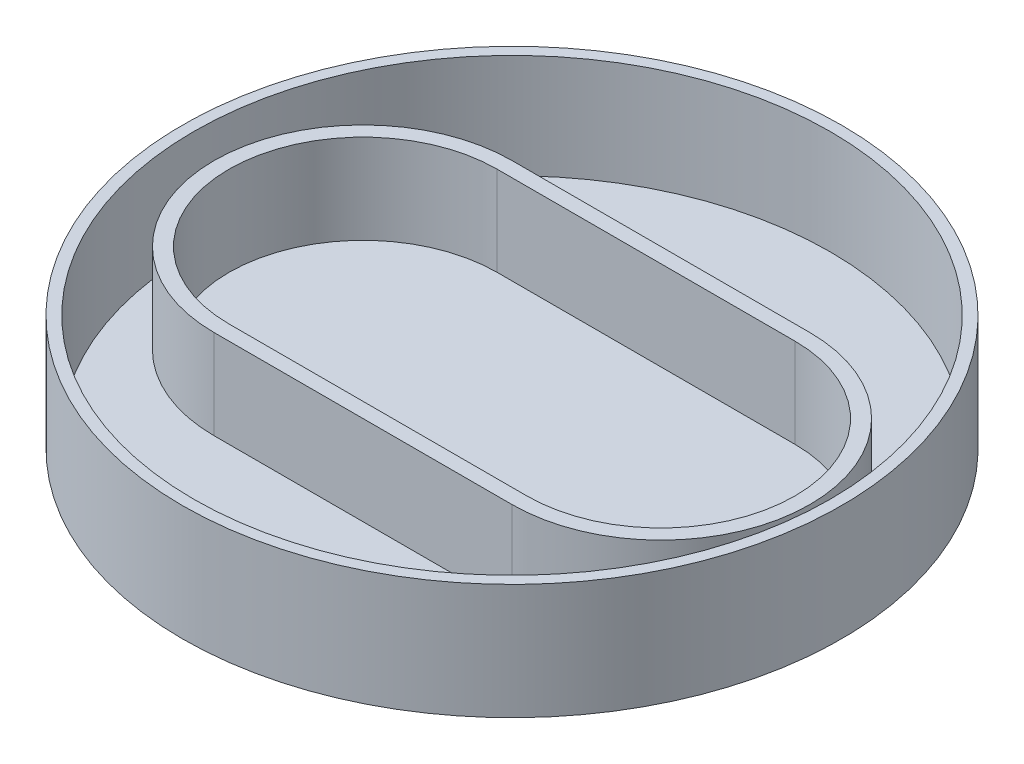
ISO-10303-21;
HEADER;
FILE_DESCRIPTION(('STEP AP214'),'2;1');
FILE_NAME('part.step','',(''),(''),'','','');
FILE_SCHEMA(('AUTOMOTIVE_DESIGN { 1 0 10303 214 1 1 1 1 }'));
ENDSEC;
DATA;
#1=APPLICATION_CONTEXT('core data for automotive mechanical design processes');
#2=APPLICATION_PROTOCOL_DEFINITION('international standard','automotive_design',2000,#1);
#3=PRODUCT_CONTEXT('',#1,'mechanical');
#4=PRODUCT('Part','Part','',(#3));
#5=PRODUCT_RELATED_PRODUCT_CATEGORY('part','',(#4));
#6=PRODUCT_DEFINITION_FORMATION('','',#4);
#7=PRODUCT_DEFINITION_CONTEXT('part definition',#1,'design');
#8=PRODUCT_DEFINITION('design','',#6,#7);
#9=PRODUCT_DEFINITION_SHAPE('','',#8);
#10=(LENGTH_UNIT() NAMED_UNIT(*) SI_UNIT(.MILLI.,.METRE.));
#11=(NAMED_UNIT(*) PLANE_ANGLE_UNIT() SI_UNIT($,.RADIAN.));
#12=(NAMED_UNIT(*) SI_UNIT($,.STERADIAN.) SOLID_ANGLE_UNIT());
#13=UNCERTAINTY_MEASURE_WITH_UNIT(LENGTH_MEASURE(1.E-05),#10,'distance_accuracy_value','');
#14=(GEOMETRIC_REPRESENTATION_CONTEXT(3) GLOBAL_UNCERTAINTY_ASSIGNED_CONTEXT((#13)) GLOBAL_UNIT_ASSIGNED_CONTEXT((#10,
#11,#12)) REPRESENTATION_CONTEXT('',''));
#15=CARTESIAN_POINT('',(0.,0.,0.));
#16=DIRECTION('',(0.,0.,1.));
#17=DIRECTION('',(1.,0.,0.));
#18=AXIS2_PLACEMENT_3D('',#15,#16,#17);
#19=CARTESIAN_POINT('',(42.75,1.5,0.));
#20=DIRECTION('',(0.,1.,0.));
#21=DIRECTION('',(0.,0.,1.));
#22=AXIS2_PLACEMENT_3D('',#19,#20,#21);
#23=PLANE('',#22);
#24=CARTESIAN_POINT('',(0.,1.5,0.));
#25=DIRECTION('',(0.,-1.,0.));
#26=DIRECTION('',(0.,0.,-1.));
#27=AXIS2_PLACEMENT_3D('',#24,#25,#26);
#28=CIRCLE('',#27,42.75);
#29=CARTESIAN_POINT('',(0.,1.5,-42.75));
#30=VERTEX_POINT('',#29);
#31=EDGE_CURVE('E144',#30,#30,#28,.T.);
#32=ORIENTED_EDGE('',*,*,#31,.F.);
#33=EDGE_LOOP('',(#32));
#34=FACE_BOUND('',#33,.T.);
#35=CARTESIAN_POINT('',(-20.,1.5,-1.4034377966634E-13));
#36=DIRECTION('',(0.,1.,0.));
#37=DIRECTION('',(0.,0.,1.));
#38=AXIS2_PLACEMENT_3D('',#35,#36,#37);
#39=CIRCLE('',#38,20.0000000000001);
#40=CARTESIAN_POINT('',(-19.9999999999999,1.5,-20.0000000000001));
#41=VERTEX_POINT('',#40);
#42=CARTESIAN_POINT('',(-20.,1.5,20.));
#43=VERTEX_POINT('',#42);
#44=EDGE_CURVE('E241',#41,#43,#39,.T.);
#45=ORIENTED_EDGE('',*,*,#44,.F.);
#46=DIRECTION('',(-1.,0.,0.));
#47=VECTOR('',#46,1.);
#48=CARTESIAN_POINT('',(0.,1.5,-20.0000000000001));
#49=LINE('',#48,#47);
#50=CARTESIAN_POINT('',(20.,1.5,-20.));
#51=VERTEX_POINT('',#50);
#52=EDGE_CURVE('E132',#51,#41,#49,.T.);
#53=ORIENTED_EDGE('',*,*,#52,.F.);
#54=CARTESIAN_POINT('',(20.,1.5,0.));
#55=DIRECTION('',(0.,1.,0.));
#56=DIRECTION('',(0.,0.,1.));
#57=AXIS2_PLACEMENT_3D('',#54,#55,#56);
#58=CIRCLE('',#57,20.);
#59=CARTESIAN_POINT('',(20.,1.5,20.));
#60=VERTEX_POINT('',#59);
#61=EDGE_CURVE('E205',#60,#51,#58,.T.);
#62=ORIENTED_EDGE('',*,*,#61,.F.);
#63=DIRECTION('',(1.,0.,0.));
#64=VECTOR('',#63,1.);
#65=CARTESIAN_POINT('',(0.,1.5,20.));
#66=LINE('',#65,#64);
#67=EDGE_CURVE('E244',#43,#60,#66,.T.);
#68=ORIENTED_EDGE('',*,*,#67,.F.);
#69=EDGE_LOOP('',(#45,#53,#62,#68));
#70=FACE_BOUND('',#69,.T.);
#71=ADVANCED_FACE('F39',(#34,#70),#23,.T.);
#72=CARTESIAN_POINT('',(0.,0.,0.));
#73=DIRECTION('',(0.,-1.,0.));
#74=DIRECTION('',(0.,0.,-1.));
#75=AXIS2_PLACEMENT_3D('',#72,#73,#74);
#76=PLANE('',#75);
#77=CARTESIAN_POINT('',(0.,0.,0.));
#78=DIRECTION('',(0.,-1.,0.));
#79=DIRECTION('',(0.,0.,-1.));
#80=AXIS2_PLACEMENT_3D('',#77,#78,#79);
#81=CIRCLE('',#80,44.25);
#82=CARTESIAN_POINT('',(0.,0.,-44.25));
#83=VERTEX_POINT('',#82);
#84=EDGE_CURVE('E11',#83,#83,#81,.T.);
#85=ORIENTED_EDGE('',*,*,#84,.T.);
#86=EDGE_LOOP('',(#85));
#87=FACE_BOUND('',#86,.T.);
#88=ADVANCED_FACE('F41',(#87),#76,.T.);
#89=CARTESIAN_POINT('',(0.,0.,0.));
#90=DIRECTION('',(0.,-1.,0.));
#91=DIRECTION('',(0.,0.,-1.));
#92=AXIS2_PLACEMENT_3D('',#89,#90,#91);
#93=CYLINDRICAL_SURFACE('',#92,44.25);
#94=CARTESIAN_POINT('',(0.,15.5,0.));
#95=DIRECTION('',(0.,-1.,0.));
#96=DIRECTION('',(0.,0.,-1.));
#97=AXIS2_PLACEMENT_3D('',#94,#95,#96);
#98=CIRCLE('',#97,44.25);
#99=CARTESIAN_POINT('',(0.,15.5,-44.25));
#100=VERTEX_POINT('',#99);
#101=EDGE_CURVE('E48',#100,#100,#98,.T.);
#102=ORIENTED_EDGE('',*,*,#101,.T.);
#103=EDGE_LOOP('',(#102));
#104=FACE_BOUND('',#103,.T.);
#105=ORIENTED_EDGE('',*,*,#84,.F.);
#106=EDGE_LOOP('',(#105));
#107=FACE_BOUND('',#106,.T.);
#108=ADVANCED_FACE('F156',(#104,#107),#93,.T.);
#109=CARTESIAN_POINT('',(44.25,15.5,0.));
#110=DIRECTION('',(0.,1.,0.));
#111=DIRECTION('',(0.,0.,1.));
#112=AXIS2_PLACEMENT_3D('',#109,#110,#111);
#113=PLANE('',#112);
#114=CARTESIAN_POINT('',(0.,15.5,0.));
#115=DIRECTION('',(0.,-1.,0.));
#116=DIRECTION('',(0.,0.,-1.));
#117=AXIS2_PLACEMENT_3D('',#114,#115,#116);
#118=CIRCLE('',#117,42.75);
#119=CARTESIAN_POINT('',(0.,15.5,-42.75));
#120=VERTEX_POINT('',#119);
#121=EDGE_CURVE('E148',#120,#120,#118,.T.);
#122=ORIENTED_EDGE('',*,*,#121,.T.);
#123=EDGE_LOOP('',(#122));
#124=FACE_BOUND('',#123,.T.);
#125=ORIENTED_EDGE('',*,*,#101,.F.);
#126=EDGE_LOOP('',(#125));
#127=FACE_BOUND('',#126,.T.);
#128=ADVANCED_FACE('F159',(#124,#127),#113,.T.);
#129=CARTESIAN_POINT('',(0.,0.,0.));
#130=DIRECTION('',(0.,-1.,0.));
#131=DIRECTION('',(0.,0.,-1.));
#132=AXIS2_PLACEMENT_3D('',#129,#130,#131);
#133=CYLINDRICAL_SURFACE('',#132,42.75);
#134=ORIENTED_EDGE('',*,*,#31,.T.);
#135=EDGE_LOOP('',(#134));
#136=FACE_BOUND('',#135,.T.);
#137=ORIENTED_EDGE('',*,*,#121,.F.);
#138=EDGE_LOOP('',(#137));
#139=FACE_BOUND('',#138,.T.);
#140=ADVANCED_FACE('F161',(#136,#139),#133,.F.);
#141=CARTESIAN_POINT('',(0.,13.5,18.));
#142=DIRECTION('',(0.,0.,1.));
#143=DIRECTION('',(1.,0.,0.));
#144=AXIS2_PLACEMENT_3D('',#141,#142,#143);
#145=PLANE('',#144);
#146=DIRECTION('',(-1.,0.,0.));
#147=VECTOR('',#146,1.);
#148=CARTESIAN_POINT('',(0.,1.5,18.));
#149=LINE('',#148,#147);
#150=CARTESIAN_POINT('',(20.,1.5,18.));
#151=VERTEX_POINT('',#150);
#152=CARTESIAN_POINT('',(-20.,1.5,18.));
#153=VERTEX_POINT('',#152);
#154=EDGE_CURVE('E195',#151,#153,#149,.T.);
#155=ORIENTED_EDGE('',*,*,#154,.T.);
#156=DIRECTION('',(0.,-1.,0.));
#157=VECTOR('',#156,1.);
#158=CARTESIAN_POINT('',(-20.,13.5,18.));
#159=LINE('',#158,#157);
#160=CARTESIAN_POINT('',(-20.,13.5,18.));
#161=VERTEX_POINT('',#160);
#162=EDGE_CURVE('E149',#161,#153,#159,.T.);
#163=ORIENTED_EDGE('',*,*,#162,.F.);
#164=DIRECTION('',(-1.,0.,0.));
#165=VECTOR('',#164,1.);
#166=CARTESIAN_POINT('',(0.,13.5,18.));
#167=LINE('',#166,#165);
#168=CARTESIAN_POINT('',(20.,13.5,18.));
#169=VERTEX_POINT('',#168);
#170=EDGE_CURVE('E230',#169,#161,#167,.T.);
#171=ORIENTED_EDGE('',*,*,#170,.F.);
#172=DIRECTION('',(0.,-1.,0.));
#173=VECTOR('',#172,1.);
#174=CARTESIAN_POINT('',(20.,13.5,18.));
#175=LINE('',#174,#173);
#176=EDGE_CURVE('E135',#169,#151,#175,.T.);
#177=ORIENTED_EDGE('',*,*,#176,.T.);
#178=EDGE_LOOP('',(#155,#163,#171,#177));
#179=FACE_BOUND('',#178,.T.);
#180=ADVANCED_FACE('F168',(#179),#145,.F.);
#181=CARTESIAN_POINT('',(-20.,13.5,3.28115292532374E-11));
#182=DIRECTION('',(0.,-1.,0.));
#183=DIRECTION('',(0.,0.,-1.));
#184=AXIS2_PLACEMENT_3D('',#181,#182,#183);
#185=CYLINDRICAL_SURFACE('',#184,18.);
#186=CARTESIAN_POINT('',(-20.,1.5,3.28115292532374E-11));
#187=DIRECTION('',(0.,1.,0.));
#188=DIRECTION('',(0.,0.,1.));
#189=AXIS2_PLACEMENT_3D('',#186,#187,#188);
#190=CIRCLE('',#189,18.);
#191=CARTESIAN_POINT('',(-19.9999999999633,1.5,-17.9999999999672));
#192=VERTEX_POINT('',#191);
#193=EDGE_CURVE('E192',#153,#192,#190,.F.);
#194=ORIENTED_EDGE('',*,*,#193,.T.);
#195=DIRECTION('',(0.,-1.,0.));
#196=VECTOR('',#195,1.);
#197=CARTESIAN_POINT('',(-19.9999999999633,13.5,-17.9999999999672));
#198=LINE('',#197,#196);
#199=CARTESIAN_POINT('',(-19.9999999999633,13.5,-17.9999999999672));
#200=VERTEX_POINT('',#199);
#201=EDGE_CURVE('E213',#200,#192,#198,.T.);
#202=ORIENTED_EDGE('',*,*,#201,.F.);
#203=CARTESIAN_POINT('',(-20.,13.5,3.28115292532374E-11));
#204=DIRECTION('',(0.,1.,0.));
#205=DIRECTION('',(0.,0.,1.));
#206=AXIS2_PLACEMENT_3D('',#203,#204,#205);
#207=CIRCLE('',#206,18.);
#208=EDGE_CURVE('E227',#161,#200,#207,.F.);
#209=ORIENTED_EDGE('',*,*,#208,.F.);
#210=ORIENTED_EDGE('',*,*,#162,.T.);
#211=EDGE_LOOP('',(#194,#202,#209,#210));
#212=FACE_BOUND('',#211,.T.);
#213=ADVANCED_FACE('F266',(#212),#185,.F.);
#214=CARTESIAN_POINT('',(3.67315552972255E-11,13.5,-17.9999999999264));
#215=DIRECTION('',(2.04064196096532E-12,0.,-1.));
#216=DIRECTION('',(-1.,0.,-2.04064196096532E-12));
#217=AXIS2_PLACEMENT_3D('',#214,#215,#216);
#218=PLANE('',#217);
#219=DIRECTION('',(1.,0.,2.04064196096532E-12));
#220=VECTOR('',#219,1.);
#221=CARTESIAN_POINT('',(3.67315552972255E-11,1.5,-17.9999999999264));
#222=LINE('',#221,#220);
#223=CARTESIAN_POINT('',(20.0000000000367,1.5,-18.));
#224=VERTEX_POINT('',#223);
#225=EDGE_CURVE('E196',#192,#224,#222,.T.);
#226=ORIENTED_EDGE('',*,*,#225,.T.);
#227=DIRECTION('',(0.,-1.,0.));
#228=VECTOR('',#227,1.);
#229=CARTESIAN_POINT('',(20.0000000000367,13.5,-17.9999999998856));
#230=LINE('',#229,#228);
#231=CARTESIAN_POINT('',(20.0000000000367,13.5,-17.9999999998856));
#232=VERTEX_POINT('',#231);
#233=EDGE_CURVE('E63',#232,#224,#230,.T.);
#234=ORIENTED_EDGE('',*,*,#233,.F.);
#235=DIRECTION('',(1.,0.,2.04064196096532E-12));
#236=VECTOR('',#235,1.);
#237=CARTESIAN_POINT('',(3.67315552972255E-11,13.5,-17.9999999999264));
#238=LINE('',#237,#236);
#239=EDGE_CURVE('E224',#200,#232,#238,.T.);
#240=ORIENTED_EDGE('',*,*,#239,.F.);
#241=ORIENTED_EDGE('',*,*,#201,.T.);
#242=EDGE_LOOP('',(#226,#234,#240,#241));
#243=FACE_BOUND('',#242,.T.);
#244=ADVANCED_FACE('F262',(#243),#218,.F.);
#245=CARTESIAN_POINT('',(0.,13.5,-20.0000000000001));
#246=DIRECTION('',(0.,0.,1.));
#247=DIRECTION('',(1.,0.,0.));
#248=AXIS2_PLACEMENT_3D('',#245,#246,#247);
#249=PLANE('',#248);
#250=ORIENTED_EDGE('',*,*,#52,.T.);
#251=DIRECTION('',(0.,-1.,0.));
#252=VECTOR('',#251,1.);
#253=CARTESIAN_POINT('',(-19.9999999999999,13.5,-20.0000000000001));
#254=LINE('',#253,#252);
#255=CARTESIAN_POINT('',(-19.9999999999999,13.5,-20.0000000000001));
#256=VERTEX_POINT('',#255);
#257=EDGE_CURVE('E110',#256,#41,#254,.T.);
#258=ORIENTED_EDGE('',*,*,#257,.F.);
#259=DIRECTION('',(-1.,0.,0.));
#260=VECTOR('',#259,1.);
#261=CARTESIAN_POINT('',(0.,13.5,-20.0000000000001));
#262=LINE('',#261,#260);
#263=CARTESIAN_POINT('',(20.,13.5,-20.));
#264=VERTEX_POINT('',#263);
#265=EDGE_CURVE('E118',#264,#256,#262,.T.);
#266=ORIENTED_EDGE('',*,*,#265,.F.);
#267=DIRECTION('',(0.,-1.,0.));
#268=VECTOR('',#267,1.);
#269=CARTESIAN_POINT('',(20.,13.5,-20.));
#270=LINE('',#269,#268);
#271=EDGE_CURVE('E218',#264,#51,#270,.T.);
#272=ORIENTED_EDGE('',*,*,#271,.T.);
#273=EDGE_LOOP('',(#250,#258,#266,#272));
#274=FACE_BOUND('',#273,.T.);
#275=ADVANCED_FACE('F130',(#274),#249,.F.);
#276=CARTESIAN_POINT('',(-20.,13.5,-1.4034377966634E-13));
#277=DIRECTION('',(0.,-1.,0.));
#278=DIRECTION('',(0.,0.,-1.));
#279=AXIS2_PLACEMENT_3D('',#276,#277,#278);
#280=CYLINDRICAL_SURFACE('',#279,20.0000000000001);
#281=ORIENTED_EDGE('',*,*,#44,.T.);
#282=DIRECTION('',(0.,-1.,0.));
#283=VECTOR('',#282,1.);
#284=CARTESIAN_POINT('',(-20.,13.5,20.));
#285=LINE('',#284,#283);
#286=CARTESIAN_POINT('',(-20.,13.5,20.));
#287=VERTEX_POINT('',#286);
#288=EDGE_CURVE('E113',#287,#43,#285,.T.);
#289=ORIENTED_EDGE('',*,*,#288,.F.);
#290=CARTESIAN_POINT('',(-20.,13.5,-1.4034377966634E-13));
#291=DIRECTION('',(0.,1.,0.));
#292=DIRECTION('',(0.,0.,1.));
#293=AXIS2_PLACEMENT_3D('',#290,#291,#292);
#294=CIRCLE('',#293,20.0000000000001);
#295=EDGE_CURVE('E106',#256,#287,#294,.T.);
#296=ORIENTED_EDGE('',*,*,#295,.F.);
#297=ORIENTED_EDGE('',*,*,#257,.T.);
#298=EDGE_LOOP('',(#281,#289,#296,#297));
#299=FACE_BOUND('',#298,.T.);
#300=ADVANCED_FACE('F108',(#299),#280,.T.);
#301=CARTESIAN_POINT('',(0.,13.5,20.));
#302=DIRECTION('',(0.,0.,-1.));
#303=DIRECTION('',(-1.,0.,0.));
#304=AXIS2_PLACEMENT_3D('',#301,#302,#303);
#305=PLANE('',#304);
#306=ORIENTED_EDGE('',*,*,#67,.T.);
#307=DIRECTION('',(0.,-1.,0.));
#308=VECTOR('',#307,1.);
#309=CARTESIAN_POINT('',(20.,13.5,20.));
#310=LINE('',#309,#308);
#311=CARTESIAN_POINT('',(20.,13.5,20.));
#312=VERTEX_POINT('',#311);
#313=EDGE_CURVE('E55',#312,#60,#310,.T.);
#314=ORIENTED_EDGE('',*,*,#313,.F.);
#315=DIRECTION('',(1.,0.,0.));
#316=VECTOR('',#315,1.);
#317=CARTESIAN_POINT('',(0.,13.5,20.));
#318=LINE('',#317,#316);
#319=EDGE_CURVE('E117',#287,#312,#318,.T.);
#320=ORIENTED_EDGE('',*,*,#319,.F.);
#321=ORIENTED_EDGE('',*,*,#288,.T.);
#322=EDGE_LOOP('',(#306,#314,#320,#321));
#323=FACE_BOUND('',#322,.T.);
#324=ADVANCED_FACE('F251',(#323),#305,.F.);
#325=CARTESIAN_POINT('',(20.,13.5,0.));
#326=DIRECTION('',(0.,-1.,0.));
#327=DIRECTION('',(0.,0.,-1.));
#328=AXIS2_PLACEMENT_3D('',#325,#326,#327);
#329=CYLINDRICAL_SURFACE('',#328,20.);
#330=ORIENTED_EDGE('',*,*,#61,.T.);
#331=ORIENTED_EDGE('',*,*,#271,.F.);
#332=CARTESIAN_POINT('',(20.,13.5,0.));
#333=DIRECTION('',(0.,1.,0.));
#334=DIRECTION('',(0.,0.,1.));
#335=AXIS2_PLACEMENT_3D('',#332,#333,#334);
#336=CIRCLE('',#335,20.);
#337=EDGE_CURVE('E123',#312,#264,#336,.T.);
#338=ORIENTED_EDGE('',*,*,#337,.F.);
#339=ORIENTED_EDGE('',*,*,#313,.T.);
#340=EDGE_LOOP('',(#330,#331,#338,#339));
#341=FACE_BOUND('',#340,.T.);
#342=ADVANCED_FACE('F248',(#341),#329,.T.);
#343=CARTESIAN_POINT('',(20.,13.5,0.));
#344=DIRECTION('',(0.,-1.,0.));
#345=DIRECTION('',(0.,0.,-1.));
#346=AXIS2_PLACEMENT_3D('',#343,#344,#345);
#347=CYLINDRICAL_SURFACE('',#346,18.);
#348=CARTESIAN_POINT('',(20.,1.5,0.));
#349=DIRECTION('',(0.,1.,0.));
#350=DIRECTION('',(0.,0.,1.));
#351=AXIS2_PLACEMENT_3D('',#348,#349,#350);
#352=CIRCLE('',#351,18.);
#353=EDGE_CURVE('E128',#224,#151,#352,.F.);
#354=ORIENTED_EDGE('',*,*,#353,.T.);
#355=ORIENTED_EDGE('',*,*,#176,.F.);
#356=CARTESIAN_POINT('',(20.,13.5,0.));
#357=DIRECTION('',(0.,1.,0.));
#358=DIRECTION('',(0.,0.,1.));
#359=AXIS2_PLACEMENT_3D('',#356,#357,#358);
#360=CIRCLE('',#359,18.);
#361=EDGE_CURVE('E220',#232,#169,#360,.F.);
#362=ORIENTED_EDGE('',*,*,#361,.F.);
#363=ORIENTED_EDGE('',*,*,#233,.T.);
#364=EDGE_LOOP('',(#354,#355,#362,#363));
#365=FACE_BOUND('',#364,.T.);
#366=ADVANCED_FACE('F187',(#365),#347,.F.);
#367=CARTESIAN_POINT('',(0.,13.5,0.));
#368=DIRECTION('',(0.,1.,0.));
#369=DIRECTION('',(0.,0.,1.));
#370=AXIS2_PLACEMENT_3D('',#367,#368,#369);
#371=PLANE('',#370);
#372=ORIENTED_EDGE('',*,*,#265,.T.);
#373=ORIENTED_EDGE('',*,*,#295,.T.);
#374=ORIENTED_EDGE('',*,*,#319,.T.);
#375=ORIENTED_EDGE('',*,*,#337,.T.);
#376=EDGE_LOOP('',(#372,#373,#374,#375));
#377=FACE_BOUND('',#376,.T.);
#378=ORIENTED_EDGE('',*,*,#170,.T.);
#379=ORIENTED_EDGE('',*,*,#208,.T.);
#380=ORIENTED_EDGE('',*,*,#239,.T.);
#381=ORIENTED_EDGE('',*,*,#361,.T.);
#382=EDGE_LOOP('',(#378,#379,#380,#381));
#383=FACE_BOUND('',#382,.T.);
#384=ADVANCED_FACE('F121',(#377,#383),#371,.T.);
#385=ORIENTED_EDGE('',*,*,#193,.F.);
#386=ORIENTED_EDGE('',*,*,#154,.F.);
#387=ORIENTED_EDGE('',*,*,#353,.F.);
#388=ORIENTED_EDGE('',*,*,#225,.F.);
#389=EDGE_LOOP('',(#385,#386,#387,#388));
#390=FACE_BOUND('',#389,.T.);
#391=ADVANCED_FACE('F174',(#390),#23,.T.);
#392=CLOSED_SHELL('',(#71,#88,#108,#128,#140,#180,#213,#244,#275,#300,#324,#342,#366,#384,#391));
#393=MANIFOLD_SOLID_BREP('B2',#392);
#394=ADVANCED_BREP_SHAPE_REPRESENTATION('',(#18,#393),#14);
#395=SHAPE_DEFINITION_REPRESENTATION(#9,#394);
ENDSEC;
END-ISO-10303-21;
